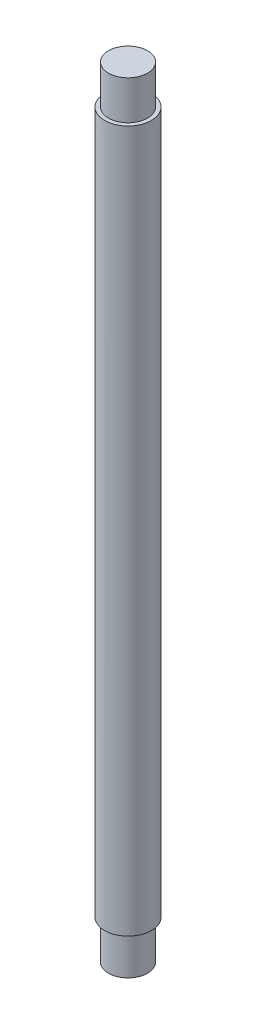
ISO-10303-21;
HEADER;
FILE_DESCRIPTION(('STEP AP214'),'2;1');
FILE_NAME('part.step','',(''),(''),'','','');
FILE_SCHEMA(('AUTOMOTIVE_DESIGN { 1 0 10303 214 1 1 1 1 }'));
ENDSEC;
DATA;
#1=APPLICATION_CONTEXT('core data for automotive mechanical design processes');
#2=APPLICATION_PROTOCOL_DEFINITION('international standard','automotive_design',2000,#1);
#3=PRODUCT_CONTEXT('',#1,'mechanical');
#4=PRODUCT('Part','Part','',(#3));
#5=PRODUCT_RELATED_PRODUCT_CATEGORY('part','',(#4));
#6=PRODUCT_DEFINITION_FORMATION('','',#4);
#7=PRODUCT_DEFINITION_CONTEXT('part definition',#1,'design');
#8=PRODUCT_DEFINITION('design','',#6,#7);
#9=PRODUCT_DEFINITION_SHAPE('','',#8);
#10=(LENGTH_UNIT() NAMED_UNIT(*) SI_UNIT(.MILLI.,.METRE.));
#11=(NAMED_UNIT(*) PLANE_ANGLE_UNIT() SI_UNIT($,.RADIAN.));
#12=(NAMED_UNIT(*) SI_UNIT($,.STERADIAN.) SOLID_ANGLE_UNIT());
#13=UNCERTAINTY_MEASURE_WITH_UNIT(LENGTH_MEASURE(1.E-05),#10,'distance_accuracy_value','');
#14=(GEOMETRIC_REPRESENTATION_CONTEXT(3) GLOBAL_UNCERTAINTY_ASSIGNED_CONTEXT((#13)) GLOBAL_UNIT_ASSIGNED_CONTEXT((#10,
#11,#12)) REPRESENTATION_CONTEXT('',''));
#15=CARTESIAN_POINT('',(0.,0.,0.));
#16=DIRECTION('',(0.,0.,1.));
#17=DIRECTION('',(1.,0.,0.));
#18=AXIS2_PLACEMENT_3D('',#15,#16,#17);
#19=CARTESIAN_POINT('',(0.,100.,0.));
#20=DIRECTION('',(0.,-1.,0.));
#21=DIRECTION('',(0.,0.,-1.));
#22=AXIS2_PLACEMENT_3D('',#19,#20,#21);
#23=CYLINDRICAL_SURFACE('',#22,3.);
#24=CARTESIAN_POINT('',(0.,5.,0.));
#25=DIRECTION('',(0.,-1.,0.));
#26=DIRECTION('',(0.,0.,-1.));
#27=AXIS2_PLACEMENT_3D('',#24,#25,#26);
#28=CIRCLE('',#27,3.);
#29=CARTESIAN_POINT('',(0.,5.,-3.));
#30=VERTEX_POINT('',#29);
#31=EDGE_CURVE('E10',#30,#30,#28,.T.);
#32=ORIENTED_EDGE('',*,*,#31,.F.);
#33=EDGE_LOOP('',(#32));
#34=FACE_BOUND('',#33,.T.);
#35=CARTESIAN_POINT('',(0.,95.,0.));
#36=DIRECTION('',(0.,1.,0.));
#37=DIRECTION('',(0.,0.,1.));
#38=AXIS2_PLACEMENT_3D('',#35,#36,#37);
#39=CIRCLE('',#38,3.);
#40=CARTESIAN_POINT('',(0.,95.,3.));
#41=VERTEX_POINT('',#40);
#42=EDGE_CURVE('E34',#41,#41,#39,.T.);
#43=ORIENTED_EDGE('',*,*,#42,.F.);
#44=EDGE_LOOP('',(#43));
#45=FACE_BOUND('',#44,.T.);
#46=ADVANCED_FACE('F31',(#34,#45),#23,.T.);
#47=CARTESIAN_POINT('',(0.,5.,0.));
#48=DIRECTION('',(0.,-1.,0.));
#49=DIRECTION('',(0.,0.,-1.));
#50=AXIS2_PLACEMENT_3D('',#47,#48,#49);
#51=PLANE('',#50);
#52=CARTESIAN_POINT('',(0.,5.,0.));
#53=DIRECTION('',(0.,-1.,0.));
#54=DIRECTION('',(0.,0.,-1.));
#55=AXIS2_PLACEMENT_3D('',#52,#53,#54);
#56=CIRCLE('',#55,2.5);
#57=CARTESIAN_POINT('',(0.,5.,-2.5));
#58=VERTEX_POINT('',#57);
#59=EDGE_CURVE('E38',#58,#58,#56,.T.);
#60=ORIENTED_EDGE('',*,*,#59,.F.);
#61=EDGE_LOOP('',(#60));
#62=FACE_BOUND('',#61,.T.);
#63=ORIENTED_EDGE('',*,*,#31,.T.);
#64=EDGE_LOOP('',(#63));
#65=FACE_BOUND('',#64,.T.);
#66=ADVANCED_FACE('F60',(#62,#65),#51,.T.);
#67=CARTESIAN_POINT('',(0.,5.,0.));
#68=DIRECTION('',(0.,-1.,0.));
#69=DIRECTION('',(0.,0.,-1.));
#70=AXIS2_PLACEMENT_3D('',#67,#68,#69);
#71=CYLINDRICAL_SURFACE('',#70,2.5);
#72=ORIENTED_EDGE('',*,*,#59,.T.);
#73=EDGE_LOOP('',(#72));
#74=FACE_BOUND('',#73,.T.);
#75=CARTESIAN_POINT('',(0.,0.,0.));
#76=DIRECTION('',(0.,-1.,0.));
#77=DIRECTION('',(0.,0.,-1.));
#78=AXIS2_PLACEMENT_3D('',#75,#76,#77);
#79=CIRCLE('',#78,2.5);
#80=CARTESIAN_POINT('',(0.,0.,-2.5));
#81=VERTEX_POINT('',#80);
#82=EDGE_CURVE('E42',#81,#81,#79,.T.);
#83=ORIENTED_EDGE('',*,*,#82,.F.);
#84=EDGE_LOOP('',(#83));
#85=FACE_BOUND('',#84,.T.);
#86=ADVANCED_FACE('F65',(#74,#85),#71,.T.);
#87=CARTESIAN_POINT('',(0.,0.,0.));
#88=DIRECTION('',(0.,1.,0.));
#89=DIRECTION('',(0.,0.,1.));
#90=AXIS2_PLACEMENT_3D('',#87,#88,#89);
#91=PLANE('',#90);
#92=ORIENTED_EDGE('',*,*,#82,.T.);
#93=EDGE_LOOP('',(#92));
#94=FACE_BOUND('',#93,.T.);
#95=ADVANCED_FACE('F71',(#94),#91,.F.);
#96=CARTESIAN_POINT('',(0.,95.,0.));
#97=DIRECTION('',(0.,1.,0.));
#98=DIRECTION('',(0.,0.,1.));
#99=AXIS2_PLACEMENT_3D('',#96,#97,#98);
#100=PLANE('',#99);
#101=CARTESIAN_POINT('',(0.,95.,0.));
#102=DIRECTION('',(0.,1.,0.));
#103=DIRECTION('',(0.,0.,1.));
#104=AXIS2_PLACEMENT_3D('',#101,#102,#103);
#105=CIRCLE('',#104,2.5);
#106=CARTESIAN_POINT('',(0.,95.,2.5));
#107=VERTEX_POINT('',#106);
#108=EDGE_CURVE('E50',#107,#107,#105,.T.);
#109=ORIENTED_EDGE('',*,*,#108,.F.);
#110=EDGE_LOOP('',(#109));
#111=FACE_BOUND('',#110,.T.);
#112=ORIENTED_EDGE('',*,*,#42,.T.);
#113=EDGE_LOOP('',(#112));
#114=FACE_BOUND('',#113,.T.);
#115=ADVANCED_FACE('F57',(#111,#114),#100,.T.);
#116=CARTESIAN_POINT('',(0.,95.,0.));
#117=DIRECTION('',(0.,1.,0.));
#118=DIRECTION('',(0.,0.,1.));
#119=AXIS2_PLACEMENT_3D('',#116,#117,#118);
#120=CYLINDRICAL_SURFACE('',#119,2.5);
#121=ORIENTED_EDGE('',*,*,#108,.T.);
#122=EDGE_LOOP('',(#121));
#123=FACE_BOUND('',#122,.T.);
#124=CARTESIAN_POINT('',(0.,100.,0.));
#125=DIRECTION('',(0.,1.,0.));
#126=DIRECTION('',(0.,0.,1.));
#127=AXIS2_PLACEMENT_3D('',#124,#125,#126);
#128=CIRCLE('',#127,2.5);
#129=CARTESIAN_POINT('',(0.,100.,2.5));
#130=VERTEX_POINT('',#129);
#131=EDGE_CURVE('E47',#130,#130,#128,.T.);
#132=ORIENTED_EDGE('',*,*,#131,.F.);
#133=EDGE_LOOP('',(#132));
#134=FACE_BOUND('',#133,.T.);
#135=ADVANCED_FACE('F79',(#123,#134),#120,.T.);
#136=CARTESIAN_POINT('',(0.,100.,0.));
#137=DIRECTION('',(0.,1.,0.));
#138=DIRECTION('',(0.,0.,1.));
#139=AXIS2_PLACEMENT_3D('',#136,#137,#138);
#140=PLANE('',#139);
#141=ORIENTED_EDGE('',*,*,#131,.T.);
#142=EDGE_LOOP('',(#141));
#143=FACE_BOUND('',#142,.T.);
#144=ADVANCED_FACE('F77',(#143),#140,.T.);
#145=CLOSED_SHELL('',(#46,#66,#86,#95,#115,#135,#144));
#146=MANIFOLD_SOLID_BREP('B2',#145);
#147=ADVANCED_BREP_SHAPE_REPRESENTATION('',(#18,#146),#14);
#148=SHAPE_DEFINITION_REPRESENTATION(#9,#147);
ENDSEC;
END-ISO-10303-21;
